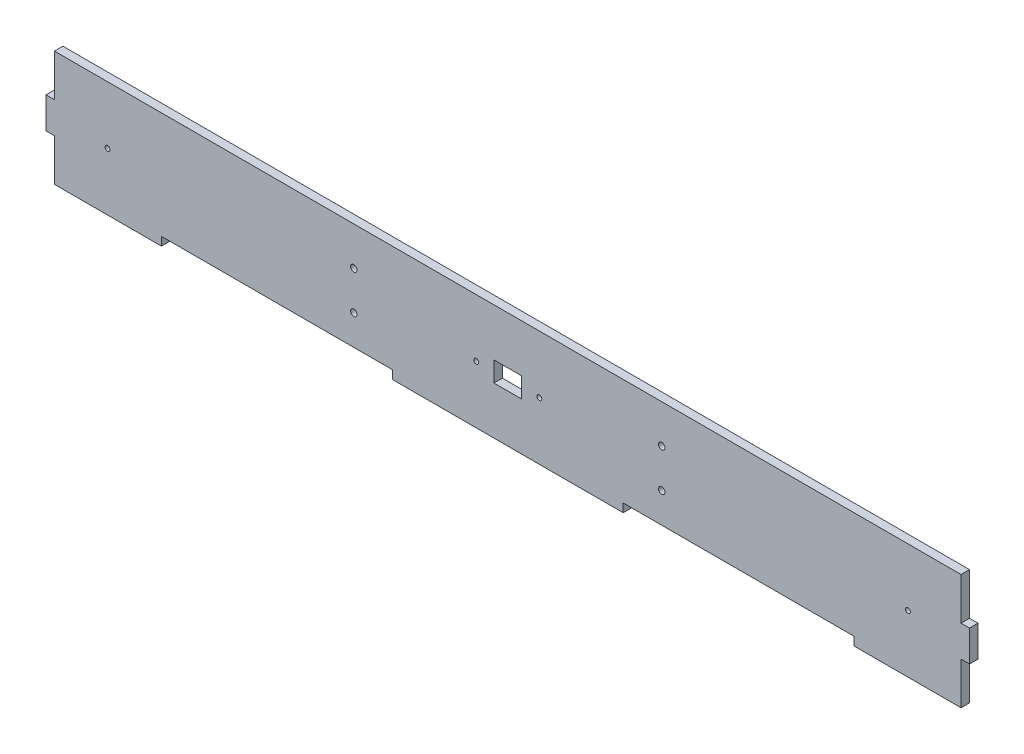
ISO-10303-21;
HEADER;
FILE_DESCRIPTION(('STEP AP214'),'2;1');
FILE_NAME('part.step','',(''),(''),'','','');
FILE_SCHEMA(('AUTOMOTIVE_DESIGN { 1 0 10303 214 1 1 1 1 }'));
ENDSEC;
DATA;
#1=APPLICATION_CONTEXT('core data for automotive mechanical design processes');
#2=APPLICATION_PROTOCOL_DEFINITION('international standard','automotive_design',2000,#1);
#3=PRODUCT_CONTEXT('',#1,'mechanical');
#4=PRODUCT('Part','Part','',(#3));
#5=PRODUCT_RELATED_PRODUCT_CATEGORY('part','',(#4));
#6=PRODUCT_DEFINITION_FORMATION('','',#4);
#7=PRODUCT_DEFINITION_CONTEXT('part definition',#1,'design');
#8=PRODUCT_DEFINITION('design','',#6,#7);
#9=PRODUCT_DEFINITION_SHAPE('','',#8);
#10=(LENGTH_UNIT() NAMED_UNIT(*) SI_UNIT(.MILLI.,.METRE.));
#11=(NAMED_UNIT(*) PLANE_ANGLE_UNIT() SI_UNIT($,.RADIAN.));
#12=(NAMED_UNIT(*) SI_UNIT($,.STERADIAN.) SOLID_ANGLE_UNIT());
#13=UNCERTAINTY_MEASURE_WITH_UNIT(LENGTH_MEASURE(1.E-05),#10,'distance_accuracy_value','');
#14=(GEOMETRIC_REPRESENTATION_CONTEXT(3) GLOBAL_UNCERTAINTY_ASSIGNED_CONTEXT((#13)) GLOBAL_UNIT_ASSIGNED_CONTEXT((#10,
#11,#12)) REPRESENTATION_CONTEXT('',''));
#15=CARTESIAN_POINT('',(0.,0.,0.));
#16=DIRECTION('',(0.,0.,1.));
#17=DIRECTION('',(1.,0.,0.));
#18=AXIS2_PLACEMENT_3D('',#15,#16,#17);
#19=CARTESIAN_POINT('',(0.,0.,5.5));
#20=DIRECTION('',(0.,0.,1.));
#21=DIRECTION('',(1.,0.,0.));
#22=AXIS2_PLACEMENT_3D('',#19,#20,#21);
#23=PLANE('',#22);
#24=CARTESIAN_POINT('',(343.,40.5,5.5));
#25=DIRECTION('',(0.,0.,1.));
#26=DIRECTION('',(1.,0.,0.));
#27=AXIS2_PLACEMENT_3D('',#24,#25,#26);
#28=CIRCLE('',#27,1.59999999999996);
#29=CARTESIAN_POINT('',(344.6,40.5,5.5));
#30=VERTEX_POINT('',#29);
#31=EDGE_CURVE('E924',#30,#30,#28,.T.);
#32=ORIENTED_EDGE('',*,*,#31,.F.);
#33=EDGE_LOOP('',(#32));
#34=FACE_BOUND('',#33,.T.);
#35=CARTESIAN_POINT('',(863.,40.5,5.5));
#36=DIRECTION('',(0.,0.,1.));
#37=DIRECTION('',(1.,0.,0.));
#38=AXIS2_PLACEMENT_3D('',#35,#36,#37);
#39=CIRCLE('',#38,1.60000000000002);
#40=CARTESIAN_POINT('',(864.6,40.5,5.5));
#41=VERTEX_POINT('',#40);
#42=EDGE_CURVE('E933',#41,#41,#39,.T.);
#43=ORIENTED_EDGE('',*,*,#42,.F.);
#44=EDGE_LOOP('',(#43));
#45=FACE_BOUND('',#44,.T.);
#46=CARTESIAN_POINT('',(703.,53.,5.5));
#47=DIRECTION('',(0.,0.,1.));
#48=DIRECTION('',(1.,0.,0.));
#49=AXIS2_PLACEMENT_3D('',#46,#47,#48);
#50=CIRCLE('',#49,2.10000000000004);
#51=CARTESIAN_POINT('',(705.1,53.,5.5));
#52=VERTEX_POINT('',#51);
#53=EDGE_CURVE('E955',#52,#52,#50,.T.);
#54=ORIENTED_EDGE('',*,*,#53,.F.);
#55=EDGE_LOOP('',(#54));
#56=FACE_BOUND('',#55,.T.);
#57=CARTESIAN_POINT('',(703.,28.,5.5));
#58=DIRECTION('',(0.,0.,1.));
#59=DIRECTION('',(1.,0.,0.));
#60=AXIS2_PLACEMENT_3D('',#57,#58,#59);
#61=CIRCLE('',#60,2.10000000000004);
#62=CARTESIAN_POINT('',(705.1,28.,5.5));
#63=VERTEX_POINT('',#62);
#64=EDGE_CURVE('E947',#63,#63,#61,.T.);
#65=ORIENTED_EDGE('',*,*,#64,.F.);
#66=EDGE_LOOP('',(#65));
#67=FACE_BOUND('',#66,.T.);
#68=CARTESIAN_POINT('',(503.,28.,5.5));
#69=DIRECTION('',(0.,0.,1.));
#70=DIRECTION('',(1.,0.,0.));
#71=AXIS2_PLACEMENT_3D('',#68,#69,#70);
#72=CIRCLE('',#71,2.10000000000004);
#73=CARTESIAN_POINT('',(505.1,28.,5.5));
#74=VERTEX_POINT('',#73);
#75=EDGE_CURVE('E939',#74,#74,#72,.T.);
#76=ORIENTED_EDGE('',*,*,#75,.F.);
#77=EDGE_LOOP('',(#76));
#78=FACE_BOUND('',#77,.T.);
#79=CARTESIAN_POINT('',(503.,53.,5.5));
#80=DIRECTION('',(0.,0.,1.));
#81=DIRECTION('',(1.,0.,0.));
#82=AXIS2_PLACEMENT_3D('',#79,#80,#81);
#83=CIRCLE('',#82,2.10000000000004);
#84=CARTESIAN_POINT('',(505.1,53.,5.5));
#85=VERTEX_POINT('',#84);
#86=EDGE_CURVE('E226',#85,#85,#83,.T.);
#87=ORIENTED_EDGE('',*,*,#86,.F.);
#88=EDGE_LOOP('',(#87));
#89=FACE_BOUND('',#88,.T.);
#90=CARTESIAN_POINT('',(623.5,40.5,5.5));
#91=DIRECTION('',(0.,0.,1.));
#92=DIRECTION('',(1.,0.,0.));
#93=AXIS2_PLACEMENT_3D('',#90,#91,#92);
#94=CIRCLE('',#93,1.60000000000002);
#95=CARTESIAN_POINT('',(625.1,40.5,5.5));
#96=VERTEX_POINT('',#95);
#97=EDGE_CURVE('E261',#96,#96,#94,.T.);
#98=ORIENTED_EDGE('',*,*,#97,.F.);
#99=EDGE_LOOP('',(#98));
#100=FACE_BOUND('',#99,.T.);
#101=CARTESIAN_POINT('',(582.5,40.5,5.5));
#102=DIRECTION('',(0.,0.,1.));
#103=DIRECTION('',(1.,0.,0.));
#104=AXIS2_PLACEMENT_3D('',#101,#102,#103);
#105=CIRCLE('',#104,1.60000000000002);
#106=CARTESIAN_POINT('',(584.1,40.5,5.5));
#107=VERTEX_POINT('',#106);
#108=EDGE_CURVE('E257',#107,#107,#105,.T.);
#109=ORIENTED_EDGE('',*,*,#108,.F.);
#110=EDGE_LOOP('',(#109));
#111=FACE_BOUND('',#110,.T.);
#112=DIRECTION('',(-1.,0.,0.));
#113=VECTOR('',#112,1.);
#114=CARTESIAN_POINT('',(897.5,78.,5.5));
#115=LINE('',#114,#113);
#116=CARTESIAN_POINT('',(897.5,78.,5.5));
#117=VERTEX_POINT('',#116);
#118=CARTESIAN_POINT('',(308.5,78.,5.5));
#119=VERTEX_POINT('',#118);
#120=EDGE_CURVE('E266',#117,#119,#115,.T.);
#121=ORIENTED_EDGE('',*,*,#120,.T.);
#122=DIRECTION('',(0.,-1.,0.));
#123=VECTOR('',#122,1.);
#124=CARTESIAN_POINT('',(308.5,78.,5.5));
#125=LINE('',#124,#123);
#126=CARTESIAN_POINT('',(308.5,50.625,5.5));
#127=VERTEX_POINT('',#126);
#128=EDGE_CURVE('E270',#119,#127,#125,.T.);
#129=ORIENTED_EDGE('',*,*,#128,.T.);
#130=DIRECTION('',(-1.,0.,0.));
#131=VECTOR('',#130,1.);
#132=CARTESIAN_POINT('',(308.5,50.625,5.5));
#133=LINE('',#132,#131);
#134=CARTESIAN_POINT('',(303.,50.625,5.5));
#135=VERTEX_POINT('',#134);
#136=EDGE_CURVE('E274',#127,#135,#133,.T.);
#137=ORIENTED_EDGE('',*,*,#136,.T.);
#138=DIRECTION('',(0.,-1.,0.));
#139=VECTOR('',#138,1.);
#140=CARTESIAN_POINT('',(303.,50.625,5.5));
#141=LINE('',#140,#139);
#142=CARTESIAN_POINT('',(303.,30.375,5.5));
#143=VERTEX_POINT('',#142);
#144=EDGE_CURVE('E277',#135,#143,#141,.T.);
#145=ORIENTED_EDGE('',*,*,#144,.T.);
#146=DIRECTION('',(1.,0.,0.));
#147=VECTOR('',#146,1.);
#148=CARTESIAN_POINT('',(303.,30.375,5.5));
#149=LINE('',#148,#147);
#150=CARTESIAN_POINT('',(308.5,30.375,5.5));
#151=VERTEX_POINT('',#150);
#152=EDGE_CURVE('E280',#143,#151,#149,.T.);
#153=ORIENTED_EDGE('',*,*,#152,.T.);
#154=DIRECTION('',(0.,-1.,0.));
#155=VECTOR('',#154,1.);
#156=CARTESIAN_POINT('',(308.5,30.375,5.5));
#157=LINE('',#156,#155);
#158=CARTESIAN_POINT('',(308.5,3.,5.5));
#159=VERTEX_POINT('',#158);
#160=EDGE_CURVE('E283',#151,#159,#157,.T.);
#161=ORIENTED_EDGE('',*,*,#160,.T.);
#162=DIRECTION('',(1.,0.,0.));
#163=VECTOR('',#162,1.);
#164=CARTESIAN_POINT('',(308.5,3.,5.5));
#165=LINE('',#164,#163);
#166=CARTESIAN_POINT('',(378.,3.,5.5));
#167=VERTEX_POINT('',#166);
#168=EDGE_CURVE('E286',#159,#167,#165,.T.);
#169=ORIENTED_EDGE('',*,*,#168,.T.);
#170=DIRECTION('',(0.,1.,0.));
#171=VECTOR('',#170,1.);
#172=CARTESIAN_POINT('',(378.,3.,5.5));
#173=LINE('',#172,#171);
#174=CARTESIAN_POINT('',(378.,8.5,5.5));
#175=VERTEX_POINT('',#174);
#176=EDGE_CURVE('E289',#167,#175,#173,.T.);
#177=ORIENTED_EDGE('',*,*,#176,.T.);
#178=DIRECTION('',(1.,0.,0.));
#179=VECTOR('',#178,1.);
#180=CARTESIAN_POINT('',(378.,8.5,5.5));
#181=LINE('',#180,#179);
#182=CARTESIAN_POINT('',(528.,8.5,5.5));
#183=VERTEX_POINT('',#182);
#184=EDGE_CURVE('E292',#175,#183,#181,.T.);
#185=ORIENTED_EDGE('',*,*,#184,.T.);
#186=DIRECTION('',(0.,-1.,0.));
#187=VECTOR('',#186,1.);
#188=CARTESIAN_POINT('',(528.,8.5,5.5));
#189=LINE('',#188,#187);
#190=CARTESIAN_POINT('',(528.,3.,5.5));
#191=VERTEX_POINT('',#190);
#192=EDGE_CURVE('E295',#183,#191,#189,.T.);
#193=ORIENTED_EDGE('',*,*,#192,.T.);
#194=DIRECTION('',(1.,0.,0.));
#195=VECTOR('',#194,1.);
#196=CARTESIAN_POINT('',(528.,3.,5.5));
#197=LINE('',#196,#195);
#198=CARTESIAN_POINT('',(678.,3.,5.5));
#199=VERTEX_POINT('',#198);
#200=EDGE_CURVE('E298',#191,#199,#197,.T.);
#201=ORIENTED_EDGE('',*,*,#200,.T.);
#202=DIRECTION('',(0.,1.,0.));
#203=VECTOR('',#202,1.);
#204=CARTESIAN_POINT('',(678.,3.,5.5));
#205=LINE('',#204,#203);
#206=CARTESIAN_POINT('',(678.,8.5,5.5));
#207=VERTEX_POINT('',#206);
#208=EDGE_CURVE('E301',#199,#207,#205,.T.);
#209=ORIENTED_EDGE('',*,*,#208,.T.);
#210=DIRECTION('',(1.,0.,0.));
#211=VECTOR('',#210,1.);
#212=CARTESIAN_POINT('',(678.,8.5,5.5));
#213=LINE('',#212,#211);
#214=CARTESIAN_POINT('',(828.,8.5,5.5));
#215=VERTEX_POINT('',#214);
#216=EDGE_CURVE('E304',#207,#215,#213,.T.);
#217=ORIENTED_EDGE('',*,*,#216,.T.);
#218=DIRECTION('',(0.,-1.,0.));
#219=VECTOR('',#218,1.);
#220=CARTESIAN_POINT('',(828.,8.5,5.5));
#221=LINE('',#220,#219);
#222=CARTESIAN_POINT('',(828.,3.,5.5));
#223=VERTEX_POINT('',#222);
#224=EDGE_CURVE('E307',#215,#223,#221,.T.);
#225=ORIENTED_EDGE('',*,*,#224,.T.);
#226=DIRECTION('',(1.,0.,0.));
#227=VECTOR('',#226,1.);
#228=CARTESIAN_POINT('',(828.,3.,5.5));
#229=LINE('',#228,#227);
#230=CARTESIAN_POINT('',(897.5,3.,5.5));
#231=VERTEX_POINT('',#230);
#232=EDGE_CURVE('E310',#223,#231,#229,.T.);
#233=ORIENTED_EDGE('',*,*,#232,.T.);
#234=DIRECTION('',(0.,1.,0.));
#235=VECTOR('',#234,1.);
#236=CARTESIAN_POINT('',(897.5,3.,5.5));
#237=LINE('',#236,#235);
#238=CARTESIAN_POINT('',(897.5,30.375,5.5));
#239=VERTEX_POINT('',#238);
#240=EDGE_CURVE('E313',#231,#239,#237,.T.);
#241=ORIENTED_EDGE('',*,*,#240,.T.);
#242=DIRECTION('',(1.,0.,0.));
#243=VECTOR('',#242,1.);
#244=CARTESIAN_POINT('',(897.5,30.375,5.5));
#245=LINE('',#244,#243);
#246=CARTESIAN_POINT('',(903.,30.375,5.5));
#247=VERTEX_POINT('',#246);
#248=EDGE_CURVE('E316',#239,#247,#245,.T.);
#249=ORIENTED_EDGE('',*,*,#248,.T.);
#250=DIRECTION('',(0.,1.,0.));
#251=VECTOR('',#250,1.);
#252=CARTESIAN_POINT('',(903.,30.375,5.5));
#253=LINE('',#252,#251);
#254=CARTESIAN_POINT('',(903.,50.625,5.5));
#255=VERTEX_POINT('',#254);
#256=EDGE_CURVE('E319',#247,#255,#253,.T.);
#257=ORIENTED_EDGE('',*,*,#256,.T.);
#258=DIRECTION('',(-1.,0.,0.));
#259=VECTOR('',#258,1.);
#260=CARTESIAN_POINT('',(903.,50.625,5.5));
#261=LINE('',#260,#259);
#262=CARTESIAN_POINT('',(897.5,50.625,5.5));
#263=VERTEX_POINT('',#262);
#264=EDGE_CURVE('E322',#255,#263,#261,.T.);
#265=ORIENTED_EDGE('',*,*,#264,.T.);
#266=DIRECTION('',(0.,1.,0.));
#267=VECTOR('',#266,1.);
#268=CARTESIAN_POINT('',(897.5,50.625,5.5));
#269=LINE('',#268,#267);
#270=EDGE_CURVE('E325',#263,#117,#269,.T.);
#271=ORIENTED_EDGE('',*,*,#270,.T.);
#272=EDGE_LOOP('',(#121,#129,#137,#145,#153,#161,#169,#177,#185,#193,#201,#209,#217,#225,#233,
#241,#249,#257,#265,#271));
#273=FACE_BOUND('',#272,.T.);
#274=DIRECTION('',(1.,0.,0.));
#275=VECTOR('',#274,1.);
#276=CARTESIAN_POINT('',(0.,47.,5.5));
#277=LINE('',#276,#275);
#278=CARTESIAN_POINT('',(594.,47.,5.5));
#279=VERTEX_POINT('',#278);
#280=CARTESIAN_POINT('',(612.,47.,5.5));
#281=VERTEX_POINT('',#280);
#282=EDGE_CURVE('E245',#279,#281,#277,.T.);
#283=ORIENTED_EDGE('',*,*,#282,.T.);
#284=DIRECTION('',(0.,-1.,0.));
#285=VECTOR('',#284,1.);
#286=CARTESIAN_POINT('',(612.,0.,5.5));
#287=LINE('',#286,#285);
#288=CARTESIAN_POINT('',(612.,34.,5.5));
#289=VERTEX_POINT('',#288);
#290=EDGE_CURVE('E213',#281,#289,#287,.T.);
#291=ORIENTED_EDGE('',*,*,#290,.T.);
#292=DIRECTION('',(1.,0.,0.));
#293=VECTOR('',#292,1.);
#294=CARTESIAN_POINT('',(0.,34.,5.5));
#295=LINE('',#294,#293);
#296=CARTESIAN_POINT('',(594.,34.,5.5));
#297=VERTEX_POINT('',#296);
#298=EDGE_CURVE('E252',#297,#289,#295,.T.);
#299=ORIENTED_EDGE('',*,*,#298,.F.);
#300=DIRECTION('',(0.,-1.,0.));
#301=VECTOR('',#300,1.);
#302=CARTESIAN_POINT('',(594.,0.,5.5));
#303=LINE('',#302,#301);
#304=EDGE_CURVE('E248',#279,#297,#303,.T.);
#305=ORIENTED_EDGE('',*,*,#304,.F.);
#306=EDGE_LOOP('',(#283,#291,#299,#305));
#307=FACE_BOUND('',#306,.T.);
#308=ADVANCED_FACE('F39',(#34,#45,#56,#67,#78,#89,#100,#111,#273,#307),#23,.T.);
#309=CARTESIAN_POINT('',(0.,0.,0.));
#310=DIRECTION('',(0.,0.,1.));
#311=DIRECTION('',(1.,0.,0.));
#312=AXIS2_PLACEMENT_3D('',#309,#310,#311);
#313=PLANE('',#312);
#314=CARTESIAN_POINT('',(343.,40.5,0.));
#315=DIRECTION('',(0.,0.,1.));
#316=DIRECTION('',(1.,0.,0.));
#317=AXIS2_PLACEMENT_3D('',#314,#315,#316);
#318=CIRCLE('',#317,1.59999999999996);
#319=CARTESIAN_POINT('',(344.6,40.5,0.));
#320=VERTEX_POINT('',#319);
#321=EDGE_CURVE('E922',#320,#320,#318,.T.);
#322=ORIENTED_EDGE('',*,*,#321,.T.);
#323=EDGE_LOOP('',(#322));
#324=FACE_BOUND('',#323,.T.);
#325=CARTESIAN_POINT('',(863.,40.5,0.));
#326=DIRECTION('',(0.,0.,1.));
#327=DIRECTION('',(1.,0.,0.));
#328=AXIS2_PLACEMENT_3D('',#325,#326,#327);
#329=CIRCLE('',#328,1.60000000000002);
#330=CARTESIAN_POINT('',(864.6,40.5,0.));
#331=VERTEX_POINT('',#330);
#332=EDGE_CURVE('E926',#331,#331,#329,.T.);
#333=ORIENTED_EDGE('',*,*,#332,.T.);
#334=EDGE_LOOP('',(#333));
#335=FACE_BOUND('',#334,.T.);
#336=CARTESIAN_POINT('',(703.,53.,0.));
#337=DIRECTION('',(0.,0.,1.));
#338=DIRECTION('',(1.,0.,0.));
#339=AXIS2_PLACEMENT_3D('',#336,#337,#338);
#340=CIRCLE('',#339,2.10000000000004);
#341=CARTESIAN_POINT('',(705.1,53.,0.));
#342=VERTEX_POINT('',#341);
#343=EDGE_CURVE('E930',#342,#342,#340,.T.);
#344=ORIENTED_EDGE('',*,*,#343,.T.);
#345=EDGE_LOOP('',(#344));
#346=FACE_BOUND('',#345,.T.);
#347=CARTESIAN_POINT('',(703.,28.,0.));
#348=DIRECTION('',(0.,0.,1.));
#349=DIRECTION('',(1.,0.,0.));
#350=AXIS2_PLACEMENT_3D('',#347,#348,#349);
#351=CIRCLE('',#350,2.10000000000004);
#352=CARTESIAN_POINT('',(705.1,28.,0.));
#353=VERTEX_POINT('',#352);
#354=EDGE_CURVE('E951',#353,#353,#351,.T.);
#355=ORIENTED_EDGE('',*,*,#354,.T.);
#356=EDGE_LOOP('',(#355));
#357=FACE_BOUND('',#356,.T.);
#358=CARTESIAN_POINT('',(503.,28.,0.));
#359=DIRECTION('',(0.,0.,1.));
#360=DIRECTION('',(1.,0.,0.));
#361=AXIS2_PLACEMENT_3D('',#358,#359,#360);
#362=CIRCLE('',#361,2.10000000000004);
#363=CARTESIAN_POINT('',(505.1,28.,0.));
#364=VERTEX_POINT('',#363);
#365=EDGE_CURVE('E943',#364,#364,#362,.T.);
#366=ORIENTED_EDGE('',*,*,#365,.T.);
#367=EDGE_LOOP('',(#366));
#368=FACE_BOUND('',#367,.T.);
#369=CARTESIAN_POINT('',(503.,53.,0.));
#370=DIRECTION('',(0.,0.,1.));
#371=DIRECTION('',(1.,0.,0.));
#372=AXIS2_PLACEMENT_3D('',#369,#370,#371);
#373=CIRCLE('',#372,2.10000000000004);
#374=CARTESIAN_POINT('',(505.1,53.,0.));
#375=VERTEX_POINT('',#374);
#376=EDGE_CURVE('E222',#375,#375,#373,.T.);
#377=ORIENTED_EDGE('',*,*,#376,.T.);
#378=EDGE_LOOP('',(#377));
#379=FACE_BOUND('',#378,.T.);
#380=CARTESIAN_POINT('',(623.5,40.5,0.));
#381=DIRECTION('',(0.,0.,1.));
#382=DIRECTION('',(1.,0.,0.));
#383=AXIS2_PLACEMENT_3D('',#380,#381,#382);
#384=CIRCLE('',#383,1.60000000000002);
#385=CARTESIAN_POINT('',(625.1,40.5,0.));
#386=VERTEX_POINT('',#385);
#387=EDGE_CURVE('E249',#386,#386,#384,.T.);
#388=ORIENTED_EDGE('',*,*,#387,.T.);
#389=EDGE_LOOP('',(#388));
#390=FACE_BOUND('',#389,.T.);
#391=CARTESIAN_POINT('',(582.5,40.5,0.));
#392=DIRECTION('',(0.,0.,1.));
#393=DIRECTION('',(1.,0.,0.));
#394=AXIS2_PLACEMENT_3D('',#391,#392,#393);
#395=CIRCLE('',#394,1.60000000000002);
#396=CARTESIAN_POINT('',(584.1,40.5,0.));
#397=VERTEX_POINT('',#396);
#398=EDGE_CURVE('E229',#397,#397,#395,.T.);
#399=ORIENTED_EDGE('',*,*,#398,.T.);
#400=EDGE_LOOP('',(#399));
#401=FACE_BOUND('',#400,.T.);
#402=DIRECTION('',(-1.,0.,0.));
#403=VECTOR('',#402,1.);
#404=CARTESIAN_POINT('',(897.5,78.,0.));
#405=LINE('',#404,#403);
#406=CARTESIAN_POINT('',(897.5,78.,0.));
#407=VERTEX_POINT('',#406);
#408=CARTESIAN_POINT('',(308.5,78.,0.));
#409=VERTEX_POINT('',#408);
#410=EDGE_CURVE('E265',#407,#409,#405,.T.);
#411=ORIENTED_EDGE('',*,*,#410,.F.);
#412=DIRECTION('',(0.,1.,0.));
#413=VECTOR('',#412,1.);
#414=CARTESIAN_POINT('',(897.5,50.625,0.));
#415=LINE('',#414,#413);
#416=CARTESIAN_POINT('',(897.5,50.625,0.));
#417=VERTEX_POINT('',#416);
#418=EDGE_CURVE('E271',#417,#407,#415,.T.);
#419=ORIENTED_EDGE('',*,*,#418,.F.);
#420=DIRECTION('',(-1.,0.,0.));
#421=VECTOR('',#420,1.);
#422=CARTESIAN_POINT('',(903.,50.625,0.));
#423=LINE('',#422,#421);
#424=CARTESIAN_POINT('',(903.,50.625,0.));
#425=VERTEX_POINT('',#424);
#426=EDGE_CURVE('E387',#425,#417,#423,.T.);
#427=ORIENTED_EDGE('',*,*,#426,.F.);
#428=DIRECTION('',(0.,1.,0.));
#429=VECTOR('',#428,1.);
#430=CARTESIAN_POINT('',(903.,42.125,0.));
#431=LINE('',#430,#429);
#432=CARTESIAN_POINT('',(903.,30.375,0.));
#433=VERTEX_POINT('',#432);
#434=EDGE_CURVE('E384',#433,#425,#431,.T.);
#435=ORIENTED_EDGE('',*,*,#434,.F.);
#436=DIRECTION('',(1.,0.,0.));
#437=VECTOR('',#436,1.);
#438=CARTESIAN_POINT('',(897.5,30.375,0.));
#439=LINE('',#438,#437);
#440=CARTESIAN_POINT('',(897.5,30.375,0.));
#441=VERTEX_POINT('',#440);
#442=EDGE_CURVE('E380',#441,#433,#439,.T.);
#443=ORIENTED_EDGE('',*,*,#442,.F.);
#444=DIRECTION('',(0.,1.,0.));
#445=VECTOR('',#444,1.);
#446=CARTESIAN_POINT('',(897.5,3.,0.));
#447=LINE('',#446,#445);
#448=CARTESIAN_POINT('',(897.5,3.,0.));
#449=VERTEX_POINT('',#448);
#450=EDGE_CURVE('E377',#449,#441,#447,.T.);
#451=ORIENTED_EDGE('',*,*,#450,.F.);
#452=DIRECTION('',(1.,0.,0.));
#453=VECTOR('',#452,1.);
#454=CARTESIAN_POINT('',(828.,3.,0.));
#455=LINE('',#454,#453);
#456=CARTESIAN_POINT('',(828.,3.,0.));
#457=VERTEX_POINT('',#456);
#458=EDGE_CURVE('E374',#457,#449,#455,.T.);
#459=ORIENTED_EDGE('',*,*,#458,.F.);
#460=DIRECTION('',(0.,-1.,0.));
#461=VECTOR('',#460,1.);
#462=CARTESIAN_POINT('',(828.,8.5,0.));
#463=LINE('',#462,#461);
#464=CARTESIAN_POINT('',(828.,8.5,0.));
#465=VERTEX_POINT('',#464);
#466=EDGE_CURVE('E371',#465,#457,#463,.T.);
#467=ORIENTED_EDGE('',*,*,#466,.F.);
#468=DIRECTION('',(1.,0.,0.));
#469=VECTOR('',#468,1.);
#470=CARTESIAN_POINT('',(754.625,8.5,0.));
#471=LINE('',#470,#469);
#472=CARTESIAN_POINT('',(678.,8.5,0.));
#473=VERTEX_POINT('',#472);
#474=EDGE_CURVE('E368',#473,#465,#471,.T.);
#475=ORIENTED_EDGE('',*,*,#474,.F.);
#476=DIRECTION('',(0.,1.,0.));
#477=VECTOR('',#476,1.);
#478=CARTESIAN_POINT('',(678.,3.,0.));
#479=LINE('',#478,#477);
#480=CARTESIAN_POINT('',(678.,3.,0.));
#481=VERTEX_POINT('',#480);
#482=EDGE_CURVE('E364',#481,#473,#479,.T.);
#483=ORIENTED_EDGE('',*,*,#482,.F.);
#484=DIRECTION('',(1.,0.,0.));
#485=VECTOR('',#484,1.);
#486=CARTESIAN_POINT('',(528.,3.,0.));
#487=LINE('',#486,#485);
#488=CARTESIAN_POINT('',(528.,3.,0.));
#489=VERTEX_POINT('',#488);
#490=EDGE_CURVE('E361',#489,#481,#487,.T.);
#491=ORIENTED_EDGE('',*,*,#490,.F.);
#492=DIRECTION('',(0.,-1.,0.));
#493=VECTOR('',#492,1.);
#494=CARTESIAN_POINT('',(528.,8.5,0.));
#495=LINE('',#494,#493);
#496=CARTESIAN_POINT('',(528.,8.5,0.));
#497=VERTEX_POINT('',#496);
#498=EDGE_CURVE('E358',#497,#489,#495,.T.);
#499=ORIENTED_EDGE('',*,*,#498,.F.);
#500=DIRECTION('',(1.,0.,0.));
#501=VECTOR('',#500,1.);
#502=CARTESIAN_POINT('',(454.625,8.5,0.));
#503=LINE('',#502,#501);
#504=CARTESIAN_POINT('',(378.,8.5,0.));
#505=VERTEX_POINT('',#504);
#506=EDGE_CURVE('E355',#505,#497,#503,.T.);
#507=ORIENTED_EDGE('',*,*,#506,.F.);
#508=DIRECTION('',(0.,1.,0.));
#509=VECTOR('',#508,1.);
#510=CARTESIAN_POINT('',(378.,3.,0.));
#511=LINE('',#510,#509);
#512=CARTESIAN_POINT('',(378.,3.,0.));
#513=VERTEX_POINT('',#512);
#514=EDGE_CURVE('E351',#513,#505,#511,.T.);
#515=ORIENTED_EDGE('',*,*,#514,.F.);
#516=DIRECTION('',(1.,0.,0.));
#517=VECTOR('',#516,1.);
#518=CARTESIAN_POINT('',(308.5,3.,0.));
#519=LINE('',#518,#517);
#520=CARTESIAN_POINT('',(308.5,3.,0.));
#521=VERTEX_POINT('',#520);
#522=EDGE_CURVE('E348',#521,#513,#519,.T.);
#523=ORIENTED_EDGE('',*,*,#522,.F.);
#524=DIRECTION('',(0.,-1.,0.));
#525=VECTOR('',#524,1.);
#526=CARTESIAN_POINT('',(308.5,30.375,0.));
#527=LINE('',#526,#525);
#528=CARTESIAN_POINT('',(308.5,30.375,0.));
#529=VERTEX_POINT('',#528);
#530=EDGE_CURVE('E345',#529,#521,#527,.T.);
#531=ORIENTED_EDGE('',*,*,#530,.F.);
#532=DIRECTION('',(1.,0.,0.));
#533=VECTOR('',#532,1.);
#534=CARTESIAN_POINT('',(303.,30.375,0.));
#535=LINE('',#534,#533);
#536=CARTESIAN_POINT('',(303.,30.375,0.));
#537=VERTEX_POINT('',#536);
#538=EDGE_CURVE('E342',#537,#529,#535,.T.);
#539=ORIENTED_EDGE('',*,*,#538,.F.);
#540=DIRECTION('',(0.,-1.,0.));
#541=VECTOR('',#540,1.);
#542=CARTESIAN_POINT('',(303.,38.875,0.));
#543=LINE('',#542,#541);
#544=CARTESIAN_POINT('',(303.,50.625,0.));
#545=VERTEX_POINT('',#544);
#546=EDGE_CURVE('E339',#545,#537,#543,.T.);
#547=ORIENTED_EDGE('',*,*,#546,.F.);
#548=DIRECTION('',(-1.,0.,0.));
#549=VECTOR('',#548,1.);
#550=CARTESIAN_POINT('',(308.5,50.625,0.));
#551=LINE('',#550,#549);
#552=CARTESIAN_POINT('',(308.5,50.625,0.));
#553=VERTEX_POINT('',#552);
#554=EDGE_CURVE('E335',#553,#545,#551,.T.);
#555=ORIENTED_EDGE('',*,*,#554,.F.);
#556=DIRECTION('',(0.,-1.,0.));
#557=VECTOR('',#556,1.);
#558=CARTESIAN_POINT('',(308.5,78.,0.));
#559=LINE('',#558,#557);
#560=EDGE_CURVE('E332',#409,#553,#559,.T.);
#561=ORIENTED_EDGE('',*,*,#560,.F.);
#562=EDGE_LOOP('',(#411,#419,#427,#435,#443,#451,#459,#467,#475,#483,#491,#499,#507,#515,#523,
#531,#539,#547,#555,#561));
#563=FACE_BOUND('',#562,.T.);
#564=DIRECTION('',(0.,-1.,0.));
#565=VECTOR('',#564,1.);
#566=CARTESIAN_POINT('',(612.,0.,0.));
#567=LINE('',#566,#565);
#568=CARTESIAN_POINT('',(612.,47.,0.));
#569=VERTEX_POINT('',#568);
#570=CARTESIAN_POINT('',(612.,34.,0.));
#571=VERTEX_POINT('',#570);
#572=EDGE_CURVE('E206',#569,#571,#567,.T.);
#573=ORIENTED_EDGE('',*,*,#572,.F.);
#574=DIRECTION('',(1.,0.,0.));
#575=VECTOR('',#574,1.);
#576=CARTESIAN_POINT('',(0.,47.,0.));
#577=LINE('',#576,#575);
#578=CARTESIAN_POINT('',(594.,47.,0.));
#579=VERTEX_POINT('',#578);
#580=EDGE_CURVE('E200',#579,#569,#577,.T.);
#581=ORIENTED_EDGE('',*,*,#580,.F.);
#582=DIRECTION('',(0.,-1.,0.));
#583=VECTOR('',#582,1.);
#584=CARTESIAN_POINT('',(594.,0.,0.));
#585=LINE('',#584,#583);
#586=CARTESIAN_POINT('',(594.,34.,0.));
#587=VERTEX_POINT('',#586);
#588=EDGE_CURVE('E63',#579,#587,#585,.T.);
#589=ORIENTED_EDGE('',*,*,#588,.T.);
#590=DIRECTION('',(1.,0.,0.));
#591=VECTOR('',#590,1.);
#592=CARTESIAN_POINT('',(0.,34.,0.));
#593=LINE('',#592,#591);
#594=EDGE_CURVE('E216',#587,#571,#593,.T.);
#595=ORIENTED_EDGE('',*,*,#594,.T.);
#596=EDGE_LOOP('',(#573,#581,#589,#595));
#597=FACE_BOUND('',#596,.T.);
#598=ADVANCED_FACE('F219',(#324,#335,#346,#357,#368,#379,#390,#401,#563,#597),#313,.F.);
#599=CARTESIAN_POINT('',(897.5,78.,5.5));
#600=DIRECTION('',(0.,-1.,0.));
#601=DIRECTION('',(0.,0.,-1.));
#602=AXIS2_PLACEMENT_3D('',#599,#600,#601);
#603=PLANE('',#602);
#604=ORIENTED_EDGE('',*,*,#410,.T.);
#605=DIRECTION('',(0.,0.,-1.));
#606=VECTOR('',#605,1.);
#607=CARTESIAN_POINT('',(308.5,78.,5.5));
#608=LINE('',#607,#606);
#609=EDGE_CURVE('E11',#119,#409,#608,.T.);
#610=ORIENTED_EDGE('',*,*,#609,.F.);
#611=ORIENTED_EDGE('',*,*,#120,.F.);
#612=DIRECTION('',(0.,0.,-1.));
#613=VECTOR('',#612,1.);
#614=CARTESIAN_POINT('',(897.5,78.,5.5));
#615=LINE('',#614,#613);
#616=EDGE_CURVE('E328',#117,#407,#615,.T.);
#617=ORIENTED_EDGE('',*,*,#616,.T.);
#618=EDGE_LOOP('',(#604,#610,#611,#617));
#619=FACE_BOUND('',#618,.T.);
#620=ADVANCED_FACE('F41',(#619),#603,.F.);
#621=CARTESIAN_POINT('',(308.5,78.,5.5));
#622=DIRECTION('',(1.,0.,0.));
#623=DIRECTION('',(0.,0.,-1.));
#624=AXIS2_PLACEMENT_3D('',#621,#622,#623);
#625=PLANE('',#624);
#626=ORIENTED_EDGE('',*,*,#560,.T.);
#627=DIRECTION('',(0.,0.,-1.));
#628=VECTOR('',#627,1.);
#629=CARTESIAN_POINT('',(308.5,50.625,5.5));
#630=LINE('',#629,#628);
#631=EDGE_CURVE('E48',#127,#553,#630,.T.);
#632=ORIENTED_EDGE('',*,*,#631,.F.);
#633=ORIENTED_EDGE('',*,*,#128,.F.);
#634=ORIENTED_EDGE('',*,*,#609,.T.);
#635=EDGE_LOOP('',(#626,#632,#633,#634));
#636=FACE_BOUND('',#635,.T.);
#637=ADVANCED_FACE('F489',(#636),#625,.F.);
#638=CARTESIAN_POINT('',(308.5,50.625,5.5));
#639=DIRECTION('',(0.,-1.,0.));
#640=DIRECTION('',(0.,0.,-1.));
#641=AXIS2_PLACEMENT_3D('',#638,#639,#640);
#642=PLANE('',#641);
#643=ORIENTED_EDGE('',*,*,#554,.T.);
#644=DIRECTION('',(0.,0.,-1.));
#645=VECTOR('',#644,1.);
#646=CARTESIAN_POINT('',(303.,50.625,5.5));
#647=LINE('',#646,#645);
#648=EDGE_CURVE('E459',#135,#545,#647,.T.);
#649=ORIENTED_EDGE('',*,*,#648,.F.);
#650=ORIENTED_EDGE('',*,*,#136,.F.);
#651=ORIENTED_EDGE('',*,*,#631,.T.);
#652=EDGE_LOOP('',(#643,#649,#650,#651));
#653=FACE_BOUND('',#652,.T.);
#654=ADVANCED_FACE('F468',(#653),#642,.F.);
#655=CARTESIAN_POINT('',(303.,38.875,5.5));
#656=DIRECTION('',(1.,0.,0.));
#657=DIRECTION('',(0.,0.,-1.));
#658=AXIS2_PLACEMENT_3D('',#655,#656,#657);
#659=PLANE('',#658);
#660=ORIENTED_EDGE('',*,*,#546,.T.);
#661=DIRECTION('',(0.,0.,-1.));
#662=VECTOR('',#661,1.);
#663=CARTESIAN_POINT('',(303.,30.375,5.5));
#664=LINE('',#663,#662);
#665=EDGE_CURVE('E455',#143,#537,#664,.T.);
#666=ORIENTED_EDGE('',*,*,#665,.F.);
#667=ORIENTED_EDGE('',*,*,#144,.F.);
#668=ORIENTED_EDGE('',*,*,#648,.T.);
#669=EDGE_LOOP('',(#660,#666,#667,#668));
#670=FACE_BOUND('',#669,.T.);
#671=ADVANCED_FACE('F477',(#670),#659,.F.);
#672=CARTESIAN_POINT('',(303.,30.375,5.5));
#673=DIRECTION('',(0.,1.,0.));
#674=DIRECTION('',(0.,0.,1.));
#675=AXIS2_PLACEMENT_3D('',#672,#673,#674);
#676=PLANE('',#675);
#677=ORIENTED_EDGE('',*,*,#538,.T.);
#678=DIRECTION('',(0.,0.,-1.));
#679=VECTOR('',#678,1.);
#680=CARTESIAN_POINT('',(308.5,30.375,5.5));
#681=LINE('',#680,#679);
#682=EDGE_CURVE('E451',#151,#529,#681,.T.);
#683=ORIENTED_EDGE('',*,*,#682,.F.);
#684=ORIENTED_EDGE('',*,*,#152,.F.);
#685=ORIENTED_EDGE('',*,*,#665,.T.);
#686=EDGE_LOOP('',(#677,#683,#684,#685));
#687=FACE_BOUND('',#686,.T.);
#688=ADVANCED_FACE('F481',(#687),#676,.F.);
#689=CARTESIAN_POINT('',(308.5,30.375,5.5));
#690=DIRECTION('',(1.,0.,0.));
#691=DIRECTION('',(0.,0.,-1.));
#692=AXIS2_PLACEMENT_3D('',#689,#690,#691);
#693=PLANE('',#692);
#694=ORIENTED_EDGE('',*,*,#530,.T.);
#695=DIRECTION('',(0.,0.,-1.));
#696=VECTOR('',#695,1.);
#697=CARTESIAN_POINT('',(308.5,3.,5.5));
#698=LINE('',#697,#696);
#699=EDGE_CURVE('E447',#159,#521,#698,.T.);
#700=ORIENTED_EDGE('',*,*,#699,.F.);
#701=ORIENTED_EDGE('',*,*,#160,.F.);
#702=ORIENTED_EDGE('',*,*,#682,.T.);
#703=EDGE_LOOP('',(#694,#700,#701,#702));
#704=FACE_BOUND('',#703,.T.);
#705=ADVANCED_FACE('F559',(#704),#693,.F.);
#706=CARTESIAN_POINT('',(308.5,3.,5.5));
#707=DIRECTION('',(0.,1.,0.));
#708=DIRECTION('',(0.,0.,1.));
#709=AXIS2_PLACEMENT_3D('',#706,#707,#708);
#710=PLANE('',#709);
#711=ORIENTED_EDGE('',*,*,#522,.T.);
#712=DIRECTION('',(0.,0.,-1.));
#713=VECTOR('',#712,1.);
#714=CARTESIAN_POINT('',(378.,3.,5.5));
#715=LINE('',#714,#713);
#716=EDGE_CURVE('E443',#167,#513,#715,.T.);
#717=ORIENTED_EDGE('',*,*,#716,.F.);
#718=ORIENTED_EDGE('',*,*,#168,.F.);
#719=ORIENTED_EDGE('',*,*,#699,.T.);
#720=EDGE_LOOP('',(#711,#717,#718,#719));
#721=FACE_BOUND('',#720,.T.);
#722=ADVANCED_FACE('F556',(#721),#710,.F.);
#723=CARTESIAN_POINT('',(378.,3.,5.5));
#724=DIRECTION('',(-1.,0.,0.));
#725=DIRECTION('',(0.,0.,1.));
#726=AXIS2_PLACEMENT_3D('',#723,#724,#725);
#727=PLANE('',#726);
#728=ORIENTED_EDGE('',*,*,#514,.T.);
#729=DIRECTION('',(0.,0.,-1.));
#730=VECTOR('',#729,1.);
#731=CARTESIAN_POINT('',(378.,8.5,5.5));
#732=LINE('',#731,#730);
#733=EDGE_CURVE('E439',#175,#505,#732,.T.);
#734=ORIENTED_EDGE('',*,*,#733,.F.);
#735=ORIENTED_EDGE('',*,*,#176,.F.);
#736=ORIENTED_EDGE('',*,*,#716,.T.);
#737=EDGE_LOOP('',(#728,#734,#735,#736));
#738=FACE_BOUND('',#737,.T.);
#739=ADVANCED_FACE('F552',(#738),#727,.F.);
#740=CARTESIAN_POINT('',(454.625,8.5,5.5));
#741=DIRECTION('',(0.,1.,0.));
#742=DIRECTION('',(0.,0.,1.));
#743=AXIS2_PLACEMENT_3D('',#740,#741,#742);
#744=PLANE('',#743);
#745=ORIENTED_EDGE('',*,*,#506,.T.);
#746=DIRECTION('',(0.,0.,-1.));
#747=VECTOR('',#746,1.);
#748=CARTESIAN_POINT('',(528.,8.5,5.5));
#749=LINE('',#748,#747);
#750=EDGE_CURVE('E435',#183,#497,#749,.T.);
#751=ORIENTED_EDGE('',*,*,#750,.F.);
#752=ORIENTED_EDGE('',*,*,#184,.F.);
#753=ORIENTED_EDGE('',*,*,#733,.T.);
#754=EDGE_LOOP('',(#745,#751,#752,#753));
#755=FACE_BOUND('',#754,.T.);
#756=ADVANCED_FACE('F548',(#755),#744,.F.);
#757=CARTESIAN_POINT('',(528.,8.5,5.5));
#758=DIRECTION('',(1.,0.,0.));
#759=DIRECTION('',(0.,0.,-1.));
#760=AXIS2_PLACEMENT_3D('',#757,#758,#759);
#761=PLANE('',#760);
#762=ORIENTED_EDGE('',*,*,#498,.T.);
#763=DIRECTION('',(0.,0.,-1.));
#764=VECTOR('',#763,1.);
#765=CARTESIAN_POINT('',(528.,3.,5.5));
#766=LINE('',#765,#764);
#767=EDGE_CURVE('E431',#191,#489,#766,.T.);
#768=ORIENTED_EDGE('',*,*,#767,.F.);
#769=ORIENTED_EDGE('',*,*,#192,.F.);
#770=ORIENTED_EDGE('',*,*,#750,.T.);
#771=EDGE_LOOP('',(#762,#768,#769,#770));
#772=FACE_BOUND('',#771,.T.);
#773=ADVANCED_FACE('F543',(#772),#761,.F.);
#774=CARTESIAN_POINT('',(528.,3.,5.5));
#775=DIRECTION('',(0.,1.,0.));
#776=DIRECTION('',(0.,0.,1.));
#777=AXIS2_PLACEMENT_3D('',#774,#775,#776);
#778=PLANE('',#777);
#779=ORIENTED_EDGE('',*,*,#490,.T.);
#780=DIRECTION('',(0.,0.,-1.));
#781=VECTOR('',#780,1.);
#782=CARTESIAN_POINT('',(678.,3.,5.5));
#783=LINE('',#782,#781);
#784=EDGE_CURVE('E427',#199,#481,#783,.T.);
#785=ORIENTED_EDGE('',*,*,#784,.F.);
#786=ORIENTED_EDGE('',*,*,#200,.F.);
#787=ORIENTED_EDGE('',*,*,#767,.T.);
#788=EDGE_LOOP('',(#779,#785,#786,#787));
#789=FACE_BOUND('',#788,.T.);
#790=ADVANCED_FACE('F538',(#789),#778,.F.);
#791=CARTESIAN_POINT('',(678.,3.,5.5));
#792=DIRECTION('',(-1.,0.,0.));
#793=DIRECTION('',(0.,0.,1.));
#794=AXIS2_PLACEMENT_3D('',#791,#792,#793);
#795=PLANE('',#794);
#796=ORIENTED_EDGE('',*,*,#482,.T.);
#797=DIRECTION('',(0.,0.,-1.));
#798=VECTOR('',#797,1.);
#799=CARTESIAN_POINT('',(678.,8.5,5.5));
#800=LINE('',#799,#798);
#801=EDGE_CURVE('E423',#207,#473,#800,.T.);
#802=ORIENTED_EDGE('',*,*,#801,.F.);
#803=ORIENTED_EDGE('',*,*,#208,.F.);
#804=ORIENTED_EDGE('',*,*,#784,.T.);
#805=EDGE_LOOP('',(#796,#802,#803,#804));
#806=FACE_BOUND('',#805,.T.);
#807=ADVANCED_FACE('F533',(#806),#795,.F.);
#808=CARTESIAN_POINT('',(754.625,8.5,5.5));
#809=DIRECTION('',(0.,1.,0.));
#810=DIRECTION('',(0.,0.,1.));
#811=AXIS2_PLACEMENT_3D('',#808,#809,#810);
#812=PLANE('',#811);
#813=ORIENTED_EDGE('',*,*,#474,.T.);
#814=DIRECTION('',(0.,0.,-1.));
#815=VECTOR('',#814,1.);
#816=CARTESIAN_POINT('',(828.,8.5,5.5));
#817=LINE('',#816,#815);
#818=EDGE_CURVE('E419',#215,#465,#817,.T.);
#819=ORIENTED_EDGE('',*,*,#818,.F.);
#820=ORIENTED_EDGE('',*,*,#216,.F.);
#821=ORIENTED_EDGE('',*,*,#801,.T.);
#822=EDGE_LOOP('',(#813,#819,#820,#821));
#823=FACE_BOUND('',#822,.T.);
#824=ADVANCED_FACE('F528',(#823),#812,.F.);
#825=CARTESIAN_POINT('',(828.,8.5,5.5));
#826=DIRECTION('',(1.,0.,0.));
#827=DIRECTION('',(0.,0.,-1.));
#828=AXIS2_PLACEMENT_3D('',#825,#826,#827);
#829=PLANE('',#828);
#830=ORIENTED_EDGE('',*,*,#466,.T.);
#831=DIRECTION('',(0.,0.,-1.));
#832=VECTOR('',#831,1.);
#833=CARTESIAN_POINT('',(828.,3.,5.5));
#834=LINE('',#833,#832);
#835=EDGE_CURVE('E415',#223,#457,#834,.T.);
#836=ORIENTED_EDGE('',*,*,#835,.F.);
#837=ORIENTED_EDGE('',*,*,#224,.F.);
#838=ORIENTED_EDGE('',*,*,#818,.T.);
#839=EDGE_LOOP('',(#830,#836,#837,#838));
#840=FACE_BOUND('',#839,.T.);
#841=ADVANCED_FACE('F524',(#840),#829,.F.);
#842=CARTESIAN_POINT('',(828.,3.,5.5));
#843=DIRECTION('',(0.,1.,0.));
#844=DIRECTION('',(0.,0.,1.));
#845=AXIS2_PLACEMENT_3D('',#842,#843,#844);
#846=PLANE('',#845);
#847=ORIENTED_EDGE('',*,*,#458,.T.);
#848=DIRECTION('',(0.,0.,-1.));
#849=VECTOR('',#848,1.);
#850=CARTESIAN_POINT('',(897.5,3.,5.5));
#851=LINE('',#850,#849);
#852=EDGE_CURVE('E411',#231,#449,#851,.T.);
#853=ORIENTED_EDGE('',*,*,#852,.F.);
#854=ORIENTED_EDGE('',*,*,#232,.F.);
#855=ORIENTED_EDGE('',*,*,#835,.T.);
#856=EDGE_LOOP('',(#847,#853,#854,#855));
#857=FACE_BOUND('',#856,.T.);
#858=ADVANCED_FACE('F519',(#857),#846,.F.);
#859=CARTESIAN_POINT('',(897.5,3.,5.5));
#860=DIRECTION('',(-1.,0.,0.));
#861=DIRECTION('',(0.,0.,1.));
#862=AXIS2_PLACEMENT_3D('',#859,#860,#861);
#863=PLANE('',#862);
#864=ORIENTED_EDGE('',*,*,#450,.T.);
#865=DIRECTION('',(0.,0.,-1.));
#866=VECTOR('',#865,1.);
#867=CARTESIAN_POINT('',(897.5,30.375,5.5));
#868=LINE('',#867,#866);
#869=EDGE_CURVE('E407',#239,#441,#868,.T.);
#870=ORIENTED_EDGE('',*,*,#869,.F.);
#871=ORIENTED_EDGE('',*,*,#240,.F.);
#872=ORIENTED_EDGE('',*,*,#852,.T.);
#873=EDGE_LOOP('',(#864,#870,#871,#872));
#874=FACE_BOUND('',#873,.T.);
#875=ADVANCED_FACE('F514',(#874),#863,.F.);
#876=CARTESIAN_POINT('',(897.5,30.375,5.5));
#877=DIRECTION('',(0.,1.,0.));
#878=DIRECTION('',(0.,0.,1.));
#879=AXIS2_PLACEMENT_3D('',#876,#877,#878);
#880=PLANE('',#879);
#881=ORIENTED_EDGE('',*,*,#442,.T.);
#882=DIRECTION('',(0.,0.,-1.));
#883=VECTOR('',#882,1.);
#884=CARTESIAN_POINT('',(903.,30.375,5.5));
#885=LINE('',#884,#883);
#886=EDGE_CURVE('E403',#247,#433,#885,.T.);
#887=ORIENTED_EDGE('',*,*,#886,.F.);
#888=ORIENTED_EDGE('',*,*,#248,.F.);
#889=ORIENTED_EDGE('',*,*,#869,.T.);
#890=EDGE_LOOP('',(#881,#887,#888,#889));
#891=FACE_BOUND('',#890,.T.);
#892=ADVANCED_FACE('F509',(#891),#880,.F.);
#893=CARTESIAN_POINT('',(903.,42.125,5.5));
#894=DIRECTION('',(-1.,0.,0.));
#895=DIRECTION('',(0.,0.,1.));
#896=AXIS2_PLACEMENT_3D('',#893,#894,#895);
#897=PLANE('',#896);
#898=ORIENTED_EDGE('',*,*,#434,.T.);
#899=DIRECTION('',(0.,0.,-1.));
#900=VECTOR('',#899,1.);
#901=CARTESIAN_POINT('',(903.,50.625,5.5));
#902=LINE('',#901,#900);
#903=EDGE_CURVE('E399',#255,#425,#902,.T.);
#904=ORIENTED_EDGE('',*,*,#903,.F.);
#905=ORIENTED_EDGE('',*,*,#256,.F.);
#906=ORIENTED_EDGE('',*,*,#886,.T.);
#907=EDGE_LOOP('',(#898,#904,#905,#906));
#908=FACE_BOUND('',#907,.T.);
#909=ADVANCED_FACE('F504',(#908),#897,.F.);
#910=CARTESIAN_POINT('',(903.,50.625,5.5));
#911=DIRECTION('',(0.,-1.,0.));
#912=DIRECTION('',(0.,0.,-1.));
#913=AXIS2_PLACEMENT_3D('',#910,#911,#912);
#914=PLANE('',#913);
#915=ORIENTED_EDGE('',*,*,#426,.T.);
#916=DIRECTION('',(0.,0.,-1.));
#917=VECTOR('',#916,1.);
#918=CARTESIAN_POINT('',(897.5,50.625,5.5));
#919=LINE('',#918,#917);
#920=EDGE_CURVE('E395',#263,#417,#919,.T.);
#921=ORIENTED_EDGE('',*,*,#920,.F.);
#922=ORIENTED_EDGE('',*,*,#264,.F.);
#923=ORIENTED_EDGE('',*,*,#903,.T.);
#924=EDGE_LOOP('',(#915,#921,#922,#923));
#925=FACE_BOUND('',#924,.T.);
#926=ADVANCED_FACE('F500',(#925),#914,.F.);
#927=CARTESIAN_POINT('',(897.5,50.625,5.5));
#928=DIRECTION('',(-1.,0.,0.));
#929=DIRECTION('',(0.,0.,1.));
#930=AXIS2_PLACEMENT_3D('',#927,#928,#929);
#931=PLANE('',#930);
#932=ORIENTED_EDGE('',*,*,#418,.T.);
#933=ORIENTED_EDGE('',*,*,#616,.F.);
#934=ORIENTED_EDGE('',*,*,#270,.F.);
#935=ORIENTED_EDGE('',*,*,#920,.T.);
#936=EDGE_LOOP('',(#932,#933,#934,#935));
#937=FACE_BOUND('',#936,.T.);
#938=ADVANCED_FACE('F495',(#937),#931,.F.);
#939=CARTESIAN_POINT('',(612.,0.,0.));
#940=DIRECTION('',(-1.,0.,0.));
#941=DIRECTION('',(0.,0.,1.));
#942=AXIS2_PLACEMENT_3D('',#939,#940,#941);
#943=PLANE('',#942);
#944=DIRECTION('',(0.,0.,1.));
#945=VECTOR('',#944,1.);
#946=CARTESIAN_POINT('',(612.,47.,0.));
#947=LINE('',#946,#945);
#948=EDGE_CURVE('E55',#569,#281,#947,.T.);
#949=ORIENTED_EDGE('',*,*,#948,.F.);
#950=ORIENTED_EDGE('',*,*,#572,.T.);
#951=DIRECTION('',(0.,0.,1.));
#952=VECTOR('',#951,1.);
#953=CARTESIAN_POINT('',(612.,34.,0.));
#954=LINE('',#953,#952);
#955=EDGE_CURVE('E236',#571,#289,#954,.T.);
#956=ORIENTED_EDGE('',*,*,#955,.T.);
#957=ORIENTED_EDGE('',*,*,#290,.F.);
#958=EDGE_LOOP('',(#949,#950,#956,#957));
#959=FACE_BOUND('',#958,.T.);
#960=ADVANCED_FACE('F209',(#959),#943,.T.);
#961=CARTESIAN_POINT('',(0.,34.,0.));
#962=DIRECTION('',(0.,-1.,0.));
#963=DIRECTION('',(0.,0.,-1.));
#964=AXIS2_PLACEMENT_3D('',#961,#962,#963);
#965=PLANE('',#964);
#966=ORIENTED_EDGE('',*,*,#298,.T.);
#967=ORIENTED_EDGE('',*,*,#955,.F.);
#968=ORIENTED_EDGE('',*,*,#594,.F.);
#969=DIRECTION('',(0.,0.,1.));
#970=VECTOR('',#969,1.);
#971=CARTESIAN_POINT('',(594.,34.,0.));
#972=LINE('',#971,#970);
#973=EDGE_CURVE('E239',#587,#297,#972,.T.);
#974=ORIENTED_EDGE('',*,*,#973,.T.);
#975=EDGE_LOOP('',(#966,#967,#968,#974));
#976=FACE_BOUND('',#975,.T.);
#977=ADVANCED_FACE('F653',(#976),#965,.F.);
#978=CARTESIAN_POINT('',(594.,0.,0.));
#979=DIRECTION('',(-1.,0.,0.));
#980=DIRECTION('',(0.,0.,1.));
#981=AXIS2_PLACEMENT_3D('',#978,#979,#980);
#982=PLANE('',#981);
#983=ORIENTED_EDGE('',*,*,#304,.T.);
#984=ORIENTED_EDGE('',*,*,#973,.F.);
#985=ORIENTED_EDGE('',*,*,#588,.F.);
#986=DIRECTION('',(0.,0.,1.));
#987=VECTOR('',#986,1.);
#988=CARTESIAN_POINT('',(594.,47.,0.));
#989=LINE('',#988,#987);
#990=EDGE_CURVE('E202',#579,#279,#989,.T.);
#991=ORIENTED_EDGE('',*,*,#990,.T.);
#992=EDGE_LOOP('',(#983,#984,#985,#991));
#993=FACE_BOUND('',#992,.T.);
#994=ADVANCED_FACE('F659',(#993),#982,.F.);
#995=CARTESIAN_POINT('',(0.,47.,0.));
#996=DIRECTION('',(0.,-1.,0.));
#997=DIRECTION('',(0.,0.,-1.));
#998=AXIS2_PLACEMENT_3D('',#995,#996,#997);
#999=PLANE('',#998);
#1000=ORIENTED_EDGE('',*,*,#990,.F.);
#1001=ORIENTED_EDGE('',*,*,#580,.T.);
#1002=ORIENTED_EDGE('',*,*,#948,.T.);
#1003=ORIENTED_EDGE('',*,*,#282,.F.);
#1004=EDGE_LOOP('',(#1000,#1001,#1002,#1003));
#1005=FACE_BOUND('',#1004,.T.);
#1006=ADVANCED_FACE('F201',(#1005),#999,.T.);
#1007=CARTESIAN_POINT('',(582.5,40.5,0.));
#1008=DIRECTION('',(0.,0.,1.));
#1009=DIRECTION('',(1.,0.,0.));
#1010=AXIS2_PLACEMENT_3D('',#1007,#1008,#1009);
#1011=CYLINDRICAL_SURFACE('',#1010,1.60000000000002);
#1012=ORIENTED_EDGE('',*,*,#108,.T.);
#1013=EDGE_LOOP('',(#1012));
#1014=FACE_BOUND('',#1013,.T.);
#1015=ORIENTED_EDGE('',*,*,#398,.F.);
#1016=EDGE_LOOP('',(#1015));
#1017=FACE_BOUND('',#1016,.T.);
#1018=ADVANCED_FACE('F673',(#1014,#1017),#1011,.F.);
#1019=CARTESIAN_POINT('',(623.5,40.5,0.));
#1020=DIRECTION('',(0.,0.,1.));
#1021=DIRECTION('',(1.,0.,0.));
#1022=AXIS2_PLACEMENT_3D('',#1019,#1020,#1021);
#1023=CYLINDRICAL_SURFACE('',#1022,1.60000000000002);
#1024=ORIENTED_EDGE('',*,*,#97,.T.);
#1025=EDGE_LOOP('',(#1024));
#1026=FACE_BOUND('',#1025,.T.);
#1027=ORIENTED_EDGE('',*,*,#387,.F.);
#1028=EDGE_LOOP('',(#1027));
#1029=FACE_BOUND('',#1028,.T.);
#1030=ADVANCED_FACE('F679',(#1026,#1029),#1023,.F.);
#1031=CARTESIAN_POINT('',(503.,53.,0.));
#1032=DIRECTION('',(0.,0.,1.));
#1033=DIRECTION('',(1.,0.,0.));
#1034=AXIS2_PLACEMENT_3D('',#1031,#1032,#1033);
#1035=CYLINDRICAL_SURFACE('',#1034,2.10000000000004);
#1036=ORIENTED_EDGE('',*,*,#376,.F.);
#1037=EDGE_LOOP('',(#1036));
#1038=FACE_BOUND('',#1037,.T.);
#1039=ORIENTED_EDGE('',*,*,#86,.T.);
#1040=EDGE_LOOP('',(#1039));
#1041=FACE_BOUND('',#1040,.T.);
#1042=ADVANCED_FACE('F687',(#1038,#1041),#1035,.F.);
#1043=CARTESIAN_POINT('',(503.,28.,0.));
#1044=DIRECTION('',(0.,0.,1.));
#1045=DIRECTION('',(1.,0.,0.));
#1046=AXIS2_PLACEMENT_3D('',#1043,#1044,#1045);
#1047=CYLINDRICAL_SURFACE('',#1046,2.10000000000004);
#1048=ORIENTED_EDGE('',*,*,#365,.F.);
#1049=EDGE_LOOP('',(#1048));
#1050=FACE_BOUND('',#1049,.T.);
#1051=ORIENTED_EDGE('',*,*,#75,.T.);
#1052=EDGE_LOOP('',(#1051));
#1053=FACE_BOUND('',#1052,.T.);
#1054=ADVANCED_FACE('F695',(#1050,#1053),#1047,.F.);
#1055=CARTESIAN_POINT('',(703.,28.,0.));
#1056=DIRECTION('',(0.,0.,1.));
#1057=DIRECTION('',(1.,0.,0.));
#1058=AXIS2_PLACEMENT_3D('',#1055,#1056,#1057);
#1059=CYLINDRICAL_SURFACE('',#1058,2.10000000000004);
#1060=ORIENTED_EDGE('',*,*,#354,.F.);
#1061=EDGE_LOOP('',(#1060));
#1062=FACE_BOUND('',#1061,.T.);
#1063=ORIENTED_EDGE('',*,*,#64,.T.);
#1064=EDGE_LOOP('',(#1063));
#1065=FACE_BOUND('',#1064,.T.);
#1066=ADVANCED_FACE('F703',(#1062,#1065),#1059,.F.);
#1067=CARTESIAN_POINT('',(703.,53.,0.));
#1068=DIRECTION('',(0.,0.,1.));
#1069=DIRECTION('',(1.,0.,0.));
#1070=AXIS2_PLACEMENT_3D('',#1067,#1068,#1069);
#1071=CYLINDRICAL_SURFACE('',#1070,2.10000000000004);
#1072=ORIENTED_EDGE('',*,*,#343,.F.);
#1073=EDGE_LOOP('',(#1072));
#1074=FACE_BOUND('',#1073,.T.);
#1075=ORIENTED_EDGE('',*,*,#53,.T.);
#1076=EDGE_LOOP('',(#1075));
#1077=FACE_BOUND('',#1076,.T.);
#1078=ADVANCED_FACE('F711',(#1074,#1077),#1071,.F.);
#1079=CARTESIAN_POINT('',(863.,40.5,0.));
#1080=DIRECTION('',(0.,0.,1.));
#1081=DIRECTION('',(1.,0.,0.));
#1082=AXIS2_PLACEMENT_3D('',#1079,#1080,#1081);
#1083=CYLINDRICAL_SURFACE('',#1082,1.60000000000002);
#1084=ORIENTED_EDGE('',*,*,#332,.F.);
#1085=EDGE_LOOP('',(#1084));
#1086=FACE_BOUND('',#1085,.T.);
#1087=ORIENTED_EDGE('',*,*,#42,.T.);
#1088=EDGE_LOOP('',(#1087));
#1089=FACE_BOUND('',#1088,.T.);
#1090=ADVANCED_FACE('F719',(#1086,#1089),#1083,.F.);
#1091=CARTESIAN_POINT('',(343.,40.5,0.));
#1092=DIRECTION('',(0.,0.,1.));
#1093=DIRECTION('',(1.,0.,0.));
#1094=AXIS2_PLACEMENT_3D('',#1091,#1092,#1093);
#1095=CYLINDRICAL_SURFACE('',#1094,1.59999999999996);
#1096=ORIENTED_EDGE('',*,*,#321,.F.);
#1097=EDGE_LOOP('',(#1096));
#1098=FACE_BOUND('',#1097,.T.);
#1099=ORIENTED_EDGE('',*,*,#31,.T.);
#1100=EDGE_LOOP('',(#1099));
#1101=FACE_BOUND('',#1100,.T.);
#1102=ADVANCED_FACE('F726',(#1098,#1101),#1095,.F.);
#1103=CLOSED_SHELL('',(#308,#598,#620,#637,#654,#671,#688,#705,#722,#739,#756,#773,#790,#807,
#824,#841,#858,#875,#892,#909,#926,#938,#960,#977,#994,#1006,#1018,#1030,#1042,#1054,#1066,
#1078,#1090,#1102));
#1104=MANIFOLD_SOLID_BREP('B2',#1103);
#1105=ADVANCED_BREP_SHAPE_REPRESENTATION('',(#18,#1104),#14);
#1106=SHAPE_DEFINITION_REPRESENTATION(#9,#1105);
ENDSEC;
END-ISO-10303-21;
